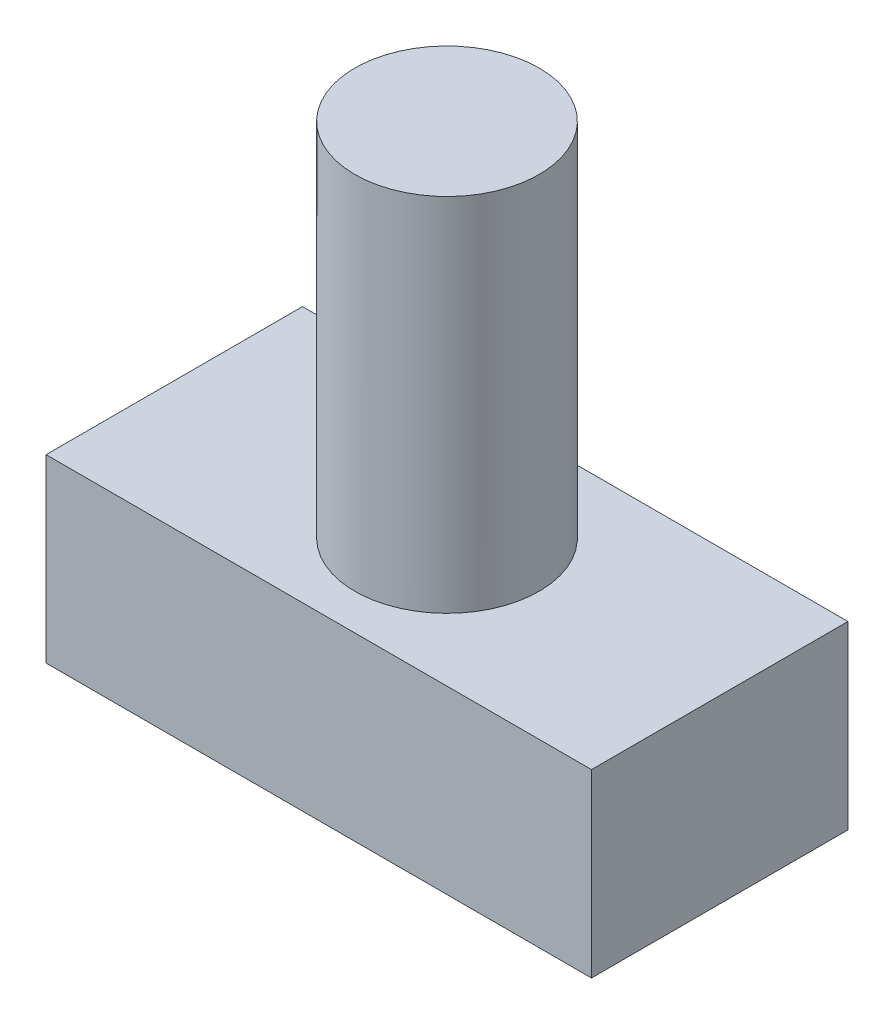
ISO-10303-21;
HEADER;
FILE_DESCRIPTION(('STEP AP214'),'2;1');
FILE_NAME('part.step','',(''),(''),'','','');
FILE_SCHEMA(('AUTOMOTIVE_DESIGN { 1 0 10303 214 1 1 1 1 }'));
ENDSEC;
DATA;
#1=APPLICATION_CONTEXT('core data for automotive mechanical design processes');
#2=APPLICATION_PROTOCOL_DEFINITION('international standard','automotive_design',2000,#1);
#3=PRODUCT_CONTEXT('',#1,'mechanical');
#4=PRODUCT('Part','Part','',(#3));
#5=PRODUCT_RELATED_PRODUCT_CATEGORY('part','',(#4));
#6=PRODUCT_DEFINITION_FORMATION('','',#4);
#7=PRODUCT_DEFINITION_CONTEXT('part definition',#1,'design');
#8=PRODUCT_DEFINITION('design','',#6,#7);
#9=PRODUCT_DEFINITION_SHAPE('','',#8);
#10=(LENGTH_UNIT() NAMED_UNIT(*) SI_UNIT(.MILLI.,.METRE.));
#11=(NAMED_UNIT(*) PLANE_ANGLE_UNIT() SI_UNIT($,.RADIAN.));
#12=(NAMED_UNIT(*) SI_UNIT($,.STERADIAN.) SOLID_ANGLE_UNIT());
#13=UNCERTAINTY_MEASURE_WITH_UNIT(LENGTH_MEASURE(1.E-05),#10,'distance_accuracy_value','');
#14=(GEOMETRIC_REPRESENTATION_CONTEXT(3) GLOBAL_UNCERTAINTY_ASSIGNED_CONTEXT((#13)) GLOBAL_UNIT_ASSIGNED_CONTEXT((#10,
#11,#12)) REPRESENTATION_CONTEXT('',''));
#15=CARTESIAN_POINT('',(0.,0.,0.));
#16=DIRECTION('',(0.,0.,1.));
#17=DIRECTION('',(1.,0.,0.));
#18=AXIS2_PLACEMENT_3D('',#15,#16,#17);
#19=CARTESIAN_POINT('',(-151.090249205626,100.,71.0417570582328));
#20=DIRECTION('',(-1.,0.,0.));
#21=DIRECTION('',(0.,0.,1.));
#22=AXIS2_PLACEMENT_3D('',#19,#20,#21);
#23=PLANE('',#22);
#24=DIRECTION('',(0.,0.,-1.));
#25=VECTOR('',#24,1.);
#26=CARTESIAN_POINT('',(-151.090249205626,0.,71.0417570582328));
#27=LINE('',#26,#25);
#28=CARTESIAN_POINT('',(-151.090249205626,0.,71.0417570582328));
#29=VERTEX_POINT('',#28);
#30=CARTESIAN_POINT('',(-151.090249205626,0.,-71.0417570582328));
#31=VERTEX_POINT('',#30);
#32=EDGE_CURVE('E104',#29,#31,#27,.T.);
#33=ORIENTED_EDGE('',*,*,#32,.F.);
#34=DIRECTION('',(0.,-1.,0.));
#35=VECTOR('',#34,1.);
#36=CARTESIAN_POINT('',(-151.090249205626,100.,71.0417570582328));
#37=LINE('',#36,#35);
#38=CARTESIAN_POINT('',(-151.090249205626,100.,71.0417570582328));
#39=VERTEX_POINT('',#38);
#40=EDGE_CURVE('E46',#39,#29,#37,.T.);
#41=ORIENTED_EDGE('',*,*,#40,.F.);
#42=DIRECTION('',(0.,0.,-1.));
#43=VECTOR('',#42,1.);
#44=CARTESIAN_POINT('',(-151.090249205626,100.,71.0417570582328));
#45=LINE('',#44,#43);
#46=CARTESIAN_POINT('',(-151.090249205626,100.,-71.0417570582328));
#47=VERTEX_POINT('',#46);
#48=EDGE_CURVE('E99',#39,#47,#45,.T.);
#49=ORIENTED_EDGE('',*,*,#48,.T.);
#50=DIRECTION('',(0.,-1.,0.));
#51=VECTOR('',#50,1.);
#52=CARTESIAN_POINT('',(-151.090249205626,100.,-71.0417570582328));
#53=LINE('',#52,#51);
#54=EDGE_CURVE('E40',#47,#31,#53,.T.);
#55=ORIENTED_EDGE('',*,*,#54,.T.);
#56=EDGE_LOOP('',(#33,#41,#49,#55));
#57=FACE_BOUND('',#56,.T.);
#58=ADVANCED_FACE('F37',(#57),#23,.T.);
#59=CARTESIAN_POINT('',(-151.090249205626,100.,71.0417570582328));
#60=DIRECTION('',(0.,0.,-1.));
#61=DIRECTION('',(-1.,0.,0.));
#62=AXIS2_PLACEMENT_3D('',#59,#60,#61);
#63=PLANE('',#62);
#64=DIRECTION('',(1.,0.,0.));
#65=VECTOR('',#64,1.);
#66=CARTESIAN_POINT('',(-151.090249205626,0.,71.0417570582328));
#67=LINE('',#66,#65);
#68=CARTESIAN_POINT('',(151.090249205626,0.,71.0417570582328));
#69=VERTEX_POINT('',#68);
#70=EDGE_CURVE('E71',#29,#69,#67,.T.);
#71=ORIENTED_EDGE('',*,*,#70,.T.);
#72=DIRECTION('',(0.,-1.,0.));
#73=VECTOR('',#72,1.);
#74=CARTESIAN_POINT('',(151.090249205626,100.,71.0417570582328));
#75=LINE('',#74,#73);
#76=CARTESIAN_POINT('',(151.090249205626,100.,71.0417570582328));
#77=VERTEX_POINT('',#76);
#78=EDGE_CURVE('E97',#77,#69,#75,.T.);
#79=ORIENTED_EDGE('',*,*,#78,.F.);
#80=DIRECTION('',(1.,0.,0.));
#81=VECTOR('',#80,1.);
#82=CARTESIAN_POINT('',(-151.090249205626,100.,71.0417570582328));
#83=LINE('',#82,#81);
#84=EDGE_CURVE('E88',#39,#77,#83,.T.);
#85=ORIENTED_EDGE('',*,*,#84,.F.);
#86=ORIENTED_EDGE('',*,*,#40,.T.);
#87=EDGE_LOOP('',(#71,#79,#85,#86));
#88=FACE_BOUND('',#87,.T.);
#89=ADVANCED_FACE('F116',(#88),#63,.F.);
#90=CARTESIAN_POINT('',(151.090249205626,100.,71.0417570582328));
#91=DIRECTION('',(-1.,0.,0.));
#92=DIRECTION('',(0.,0.,1.));
#93=AXIS2_PLACEMENT_3D('',#90,#91,#92);
#94=PLANE('',#93);
#95=DIRECTION('',(0.,0.,-1.));
#96=VECTOR('',#95,1.);
#97=CARTESIAN_POINT('',(151.090249205626,0.,71.0417570582328));
#98=LINE('',#97,#96);
#99=CARTESIAN_POINT('',(151.090249205626,0.,-71.0417570582328));
#100=VERTEX_POINT('',#99);
#101=EDGE_CURVE('E95',#69,#100,#98,.T.);
#102=ORIENTED_EDGE('',*,*,#101,.T.);
#103=DIRECTION('',(0.,-1.,0.));
#104=VECTOR('',#103,1.);
#105=CARTESIAN_POINT('',(151.090249205626,100.,-71.0417570582328));
#106=LINE('',#105,#104);
#107=CARTESIAN_POINT('',(151.090249205626,100.,-71.0417570582328));
#108=VERTEX_POINT('',#107);
#109=EDGE_CURVE('E92',#108,#100,#106,.T.);
#110=ORIENTED_EDGE('',*,*,#109,.F.);
#111=DIRECTION('',(0.,0.,-1.));
#112=VECTOR('',#111,1.);
#113=CARTESIAN_POINT('',(151.090249205626,100.,71.0417570582328));
#114=LINE('',#113,#112);
#115=EDGE_CURVE('E83',#77,#108,#114,.T.);
#116=ORIENTED_EDGE('',*,*,#115,.F.);
#117=ORIENTED_EDGE('',*,*,#78,.T.);
#118=EDGE_LOOP('',(#102,#110,#116,#117));
#119=FACE_BOUND('',#118,.T.);
#120=ADVANCED_FACE('F93',(#119),#94,.F.);
#121=CARTESIAN_POINT('',(-151.090249205626,100.,-71.0417570582328));
#122=DIRECTION('',(0.,0.,-1.));
#123=DIRECTION('',(-1.,0.,0.));
#124=AXIS2_PLACEMENT_3D('',#121,#122,#123);
#125=PLANE('',#124);
#126=DIRECTION('',(1.,0.,0.));
#127=VECTOR('',#126,1.);
#128=CARTESIAN_POINT('',(-151.090249205626,0.,-71.0417570582328));
#129=LINE('',#128,#127);
#130=EDGE_CURVE('E107',#31,#100,#129,.T.);
#131=ORIENTED_EDGE('',*,*,#130,.F.);
#132=ORIENTED_EDGE('',*,*,#54,.F.);
#133=DIRECTION('',(1.,0.,0.));
#134=VECTOR('',#133,1.);
#135=CARTESIAN_POINT('',(-151.090249205626,100.,-71.0417570582328));
#136=LINE('',#135,#134);
#137=EDGE_CURVE('E87',#47,#108,#136,.T.);
#138=ORIENTED_EDGE('',*,*,#137,.T.);
#139=ORIENTED_EDGE('',*,*,#109,.T.);
#140=EDGE_LOOP('',(#131,#132,#138,#139));
#141=FACE_BOUND('',#140,.T.);
#142=ADVANCED_FACE('F98',(#141),#125,.T.);
#143=CARTESIAN_POINT('',(0.,100.,0.));
#144=DIRECTION('',(0.,-1.,0.));
#145=DIRECTION('',(0.,0.,-1.));
#146=AXIS2_PLACEMENT_3D('',#143,#144,#145);
#147=PLANE('',#146);
#148=CARTESIAN_POINT('',(0.,100.,0.));
#149=DIRECTION('',(0.,-1.,0.));
#150=DIRECTION('',(0.,0.,-1.));
#151=AXIS2_PLACEMENT_3D('',#148,#149,#150);
#152=CIRCLE('',#151,51.0781850504787);
#153=CARTESIAN_POINT('',(0.,100.,-51.0781850504787));
#154=VERTEX_POINT('',#153);
#155=EDGE_CURVE('E11',#154,#154,#152,.F.);
#156=ORIENTED_EDGE('',*,*,#155,.F.);
#157=EDGE_LOOP('',(#156));
#158=FACE_BOUND('',#157,.T.);
#159=ORIENTED_EDGE('',*,*,#48,.F.);
#160=ORIENTED_EDGE('',*,*,#84,.T.);
#161=ORIENTED_EDGE('',*,*,#115,.T.);
#162=ORIENTED_EDGE('',*,*,#137,.F.);
#163=EDGE_LOOP('',(#159,#160,#161,#162));
#164=FACE_BOUND('',#163,.T.);
#165=ADVANCED_FACE('F86',(#158,#164),#147,.F.);
#166=CARTESIAN_POINT('',(0.,0.,0.));
#167=DIRECTION('',(0.,-1.,0.));
#168=DIRECTION('',(0.,0.,-1.));
#169=AXIS2_PLACEMENT_3D('',#166,#167,#168);
#170=PLANE('',#169);
#171=ORIENTED_EDGE('',*,*,#32,.T.);
#172=ORIENTED_EDGE('',*,*,#130,.T.);
#173=ORIENTED_EDGE('',*,*,#101,.F.);
#174=ORIENTED_EDGE('',*,*,#70,.F.);
#175=EDGE_LOOP('',(#171,#172,#173,#174));
#176=FACE_BOUND('',#175,.T.);
#177=ADVANCED_FACE('F114',(#176),#170,.T.);
#178=CARTESIAN_POINT('',(0.,300.,0.));
#179=DIRECTION('',(0.,-1.,0.));
#180=DIRECTION('',(0.,0.,-1.));
#181=AXIS2_PLACEMENT_3D('',#178,#179,#180);
#182=CYLINDRICAL_SURFACE('',#181,51.0781850504787);
#183=CARTESIAN_POINT('',(0.,300.,0.));
#184=DIRECTION('',(0.,1.,0.));
#185=DIRECTION('',(0.,0.,1.));
#186=AXIS2_PLACEMENT_3D('',#183,#184,#185);
#187=CIRCLE('',#186,51.0781850504787);
#188=CARTESIAN_POINT('',(0.,300.,51.0781850504787));
#189=VERTEX_POINT('',#188);
#190=EDGE_CURVE('E108',#189,#189,#187,.T.);
#191=ORIENTED_EDGE('',*,*,#190,.F.);
#192=EDGE_LOOP('',(#191));
#193=FACE_BOUND('',#192,.T.);
#194=ORIENTED_EDGE('',*,*,#155,.T.);
#195=EDGE_LOOP('',(#194));
#196=FACE_BOUND('',#195,.T.);
#197=ADVANCED_FACE('F135',(#193,#196),#182,.T.);
#198=CARTESIAN_POINT('',(0.,300.,0.));
#199=DIRECTION('',(0.,1.,0.));
#200=DIRECTION('',(0.,0.,1.));
#201=AXIS2_PLACEMENT_3D('',#198,#199,#200);
#202=PLANE('',#201);
#203=ORIENTED_EDGE('',*,*,#190,.T.);
#204=EDGE_LOOP('',(#203));
#205=FACE_BOUND('',#204,.T.);
#206=ADVANCED_FACE('F140',(#205),#202,.T.);
#207=CLOSED_SHELL('',(#58,#89,#120,#142,#165,#177,#197,#206));
#208=MANIFOLD_SOLID_BREP('B2',#207);
#209=ADVANCED_BREP_SHAPE_REPRESENTATION('',(#18,#208),#14);
#210=SHAPE_DEFINITION_REPRESENTATION(#9,#209);
ENDSEC;
END-ISO-10303-21;
